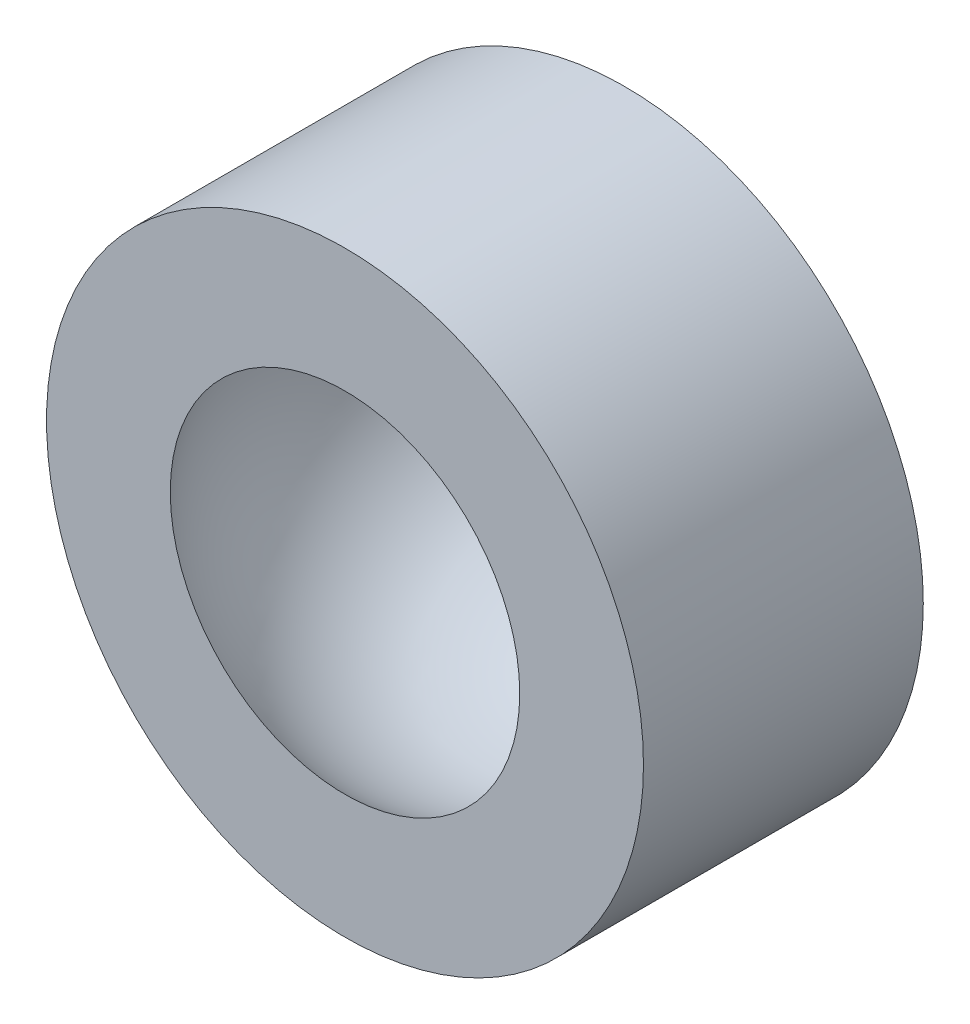
ISO-10303-21;
HEADER;
FILE_DESCRIPTION(('STEP AP214'),'2;1');
FILE_NAME('part.step','',(''),(''),'','','');
FILE_SCHEMA(('AUTOMOTIVE_DESIGN { 1 0 10303 214 1 1 1 1 }'));
ENDSEC;
DATA;
#1=APPLICATION_CONTEXT('core data for automotive mechanical design processes');
#2=APPLICATION_PROTOCOL_DEFINITION('international standard','automotive_design',2000,#1);
#3=PRODUCT_CONTEXT('',#1,'mechanical');
#4=PRODUCT('Part','Part','',(#3));
#5=PRODUCT_RELATED_PRODUCT_CATEGORY('part','',(#4));
#6=PRODUCT_DEFINITION_FORMATION('','',#4);
#7=PRODUCT_DEFINITION_CONTEXT('part definition',#1,'design');
#8=PRODUCT_DEFINITION('design','',#6,#7);
#9=PRODUCT_DEFINITION_SHAPE('','',#8);
#10=(LENGTH_UNIT() NAMED_UNIT(*) SI_UNIT(.MILLI.,.METRE.));
#11=(NAMED_UNIT(*) PLANE_ANGLE_UNIT() SI_UNIT($,.RADIAN.));
#12=(NAMED_UNIT(*) SI_UNIT($,.STERADIAN.) SOLID_ANGLE_UNIT());
#13=UNCERTAINTY_MEASURE_WITH_UNIT(LENGTH_MEASURE(1.E-05),#10,'distance_accuracy_value','');
#14=(GEOMETRIC_REPRESENTATION_CONTEXT(3) GLOBAL_UNCERTAINTY_ASSIGNED_CONTEXT((#13)) GLOBAL_UNIT_ASSIGNED_CONTEXT((#10,
#11,#12)) REPRESENTATION_CONTEXT('',''));
#15=CARTESIAN_POINT('',(0.,0.,0.));
#16=DIRECTION('',(0.,0.,1.));
#17=DIRECTION('',(1.,0.,0.));
#18=AXIS2_PLACEMENT_3D('',#15,#16,#17);
#19=CARTESIAN_POINT('',(0.,0.,-33.75));
#20=DIRECTION('',(0.,0.,1.));
#21=DIRECTION('',(1.,0.,0.));
#22=AXIS2_PLACEMENT_3D('',#19,#20,#21);
#23=CYLINDRICAL_SURFACE('',#22,72.);
#24=CARTESIAN_POINT('',(0.,0.,-33.75));
#25=DIRECTION('',(0.,0.,1.));
#26=DIRECTION('',(1.,0.,0.));
#27=AXIS2_PLACEMENT_3D('',#24,#25,#26);
#28=CIRCLE('',#27,72.);
#29=CARTESIAN_POINT('',(72.,0.,-33.75));
#30=VERTEX_POINT('',#29);
#31=EDGE_CURVE('E10',#30,#30,#28,.T.);
#32=ORIENTED_EDGE('',*,*,#31,.T.);
#33=EDGE_LOOP('',(#32));
#34=FACE_BOUND('',#33,.T.);
#35=CARTESIAN_POINT('',(0.,0.,33.75));
#36=DIRECTION('',(0.,0.,1.));
#37=DIRECTION('',(1.,0.,0.));
#38=AXIS2_PLACEMENT_3D('',#35,#36,#37);
#39=CIRCLE('',#38,72.);
#40=CARTESIAN_POINT('',(72.,0.,33.75));
#41=VERTEX_POINT('',#40);
#42=EDGE_CURVE('E50',#41,#41,#39,.T.);
#43=ORIENTED_EDGE('',*,*,#42,.F.);
#44=EDGE_LOOP('',(#43));
#45=FACE_BOUND('',#44,.T.);
#46=ADVANCED_FACE('F42',(#34,#45),#23,.T.);
#47=CARTESIAN_POINT('',(0.,0.,-33.75));
#48=DIRECTION('',(0.,0.,1.));
#49=DIRECTION('',(1.,0.,0.));
#50=AXIS2_PLACEMENT_3D('',#47,#48,#49);
#51=PLANE('',#50);
#52=CARTESIAN_POINT('',(0.,0.,-33.75));
#53=DIRECTION('',(0.,0.,1.));
#54=DIRECTION('',(1.,0.,0.));
#55=AXIS2_PLACEMENT_3D('',#52,#53,#54);
#56=CIRCLE('',#55,42.1537364891892);
#57=CARTESIAN_POINT('',(42.1537364891892,0.,-33.75));
#58=VERTEX_POINT('',#57);
#59=EDGE_CURVE('E55',#58,#58,#56,.T.);
#60=ORIENTED_EDGE('',*,*,#59,.T.);
#61=EDGE_LOOP('',(#60));
#62=FACE_BOUND('',#61,.T.);
#63=ORIENTED_EDGE('',*,*,#31,.F.);
#64=EDGE_LOOP('',(#63));
#65=FACE_BOUND('',#64,.T.);
#66=ADVANCED_FACE('F72',(#62,#65),#51,.F.);
#67=CARTESIAN_POINT('',(0.,0.,33.75));
#68=DIRECTION('',(0.,0.,1.));
#69=DIRECTION('',(1.,0.,0.));
#70=AXIS2_PLACEMENT_3D('',#67,#68,#69);
#71=PLANE('',#70);
#72=CARTESIAN_POINT('',(0.,0.,33.75));
#73=DIRECTION('',(0.,0.,1.));
#74=DIRECTION('',(1.,0.,0.));
#75=AXIS2_PLACEMENT_3D('',#72,#73,#74);
#76=CIRCLE('',#75,42.1537364891892);
#77=CARTESIAN_POINT('',(42.1537364891892,0.,33.75));
#78=VERTEX_POINT('',#77);
#79=EDGE_CURVE('E45',#78,#78,#76,.T.);
#80=ORIENTED_EDGE('',*,*,#79,.F.);
#81=EDGE_LOOP('',(#80));
#82=FACE_BOUND('',#81,.T.);
#83=ORIENTED_EDGE('',*,*,#42,.T.);
#84=EDGE_LOOP('',(#83));
#85=FACE_BOUND('',#84,.T.);
#86=ADVANCED_FACE('F69',(#82,#85),#71,.T.);
#87=CARTESIAN_POINT('',(0.,0.,0.));
#88=DIRECTION('',(0.,1.,0.));
#89=DIRECTION('',(1.,0.,0.));
#90=AXIS2_PLACEMENT_3D('',#87,#88,#89);
#91=SPHERICAL_SURFACE('',#90,54.);
#92=CARTESIAN_POINT('',(0.,0.,0.));
#93=DIRECTION('',(0.,0.,1.));
#94=DIRECTION('',(1.,0.,0.));
#95=AXIS2_PLACEMENT_3D('',#92,#93,#94);
#96=SPHERICAL_SURFACE('',#95,54.);
#97=ORIENTED_EDGE('',*,*,#79,.T.);
#98=EDGE_LOOP('',(#97));
#99=FACE_BOUND('',#98,.T.);
#100=ORIENTED_EDGE('',*,*,#59,.F.);
#101=EDGE_LOOP('',(#100));
#102=FACE_BOUND('',#101,.T.);
#103=ADVANCED_FACE('F66',(#99,#102),#96,.F.);
#104=CLOSED_SHELL('',(#46,#66,#86,#103));
#105=MANIFOLD_SOLID_BREP('B2',#104);
#106=ADVANCED_BREP_SHAPE_REPRESENTATION('',(#18,#105),#14);
#107=SHAPE_DEFINITION_REPRESENTATION(#9,#106);
ENDSEC;
END-ISO-10303-21;
